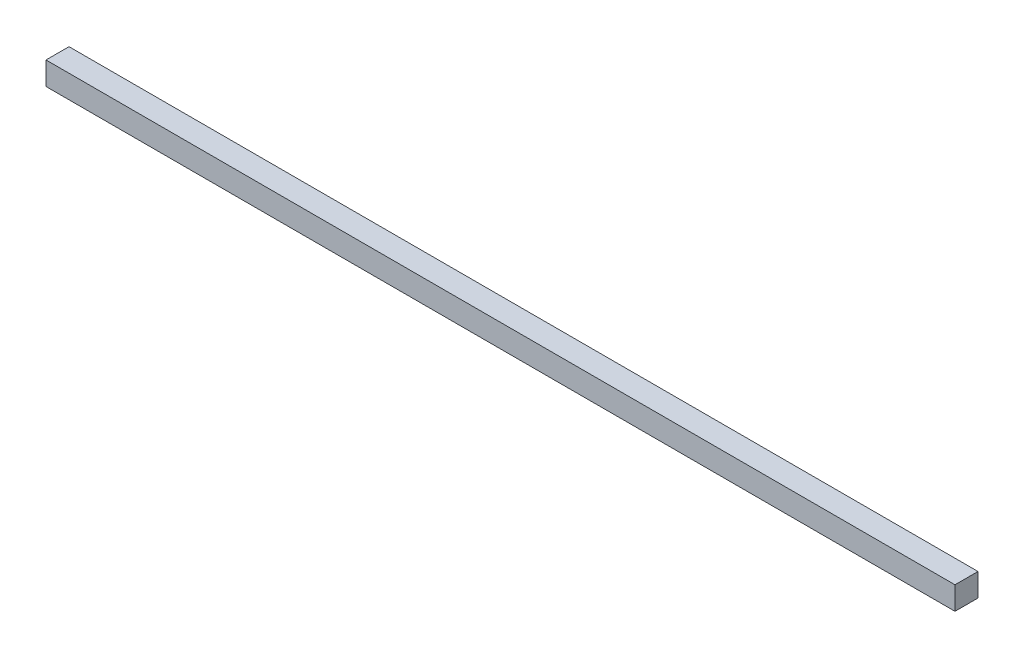
ISO-10303-21;
HEADER;
FILE_DESCRIPTION(('STEP AP214'),'2;1');
FILE_NAME('part.step','',(''),(''),'','','');
FILE_SCHEMA(('AUTOMOTIVE_DESIGN { 1 0 10303 214 1 1 1 1 }'));
ENDSEC;
DATA;
#1=APPLICATION_CONTEXT('core data for automotive mechanical design processes');
#2=APPLICATION_PROTOCOL_DEFINITION('international standard','automotive_design',2000,#1);
#3=PRODUCT_CONTEXT('',#1,'mechanical');
#4=PRODUCT('Part','Part','',(#3));
#5=PRODUCT_RELATED_PRODUCT_CATEGORY('part','',(#4));
#6=PRODUCT_DEFINITION_FORMATION('','',#4);
#7=PRODUCT_DEFINITION_CONTEXT('part definition',#1,'design');
#8=PRODUCT_DEFINITION('design','',#6,#7);
#9=PRODUCT_DEFINITION_SHAPE('','',#8);
#10=(LENGTH_UNIT() NAMED_UNIT(*) SI_UNIT(.MILLI.,.METRE.));
#11=(NAMED_UNIT(*) PLANE_ANGLE_UNIT() SI_UNIT($,.RADIAN.));
#12=(NAMED_UNIT(*) SI_UNIT($,.STERADIAN.) SOLID_ANGLE_UNIT());
#13=UNCERTAINTY_MEASURE_WITH_UNIT(LENGTH_MEASURE(1.E-05),#10,'distance_accuracy_value','');
#14=(GEOMETRIC_REPRESENTATION_CONTEXT(3) GLOBAL_UNCERTAINTY_ASSIGNED_CONTEXT((#13)) GLOBAL_UNIT_ASSIGNED_CONTEXT((#10,
#11,#12)) REPRESENTATION_CONTEXT('',''));
#15=CARTESIAN_POINT('',(0.,0.,0.));
#16=DIRECTION('',(0.,0.,1.));
#17=DIRECTION('',(1.,0.,0.));
#18=AXIS2_PLACEMENT_3D('',#15,#16,#17);
#19=CARTESIAN_POINT('',(0.,0.,6.35));
#20=DIRECTION('',(1.,0.,0.));
#21=DIRECTION('',(0.,0.,-1.));
#22=AXIS2_PLACEMENT_3D('',#19,#20,#21);
#23=PLANE('',#22);
#24=DIRECTION('',(0.,-1.,0.));
#25=VECTOR('',#24,1.);
#26=CARTESIAN_POINT('',(0.,0.,0.));
#27=LINE('',#26,#25);
#28=CARTESIAN_POINT('',(0.,6.34999999999999,0.));
#29=VERTEX_POINT('',#28);
#30=CARTESIAN_POINT('',(0.,0.,0.));
#31=VERTEX_POINT('',#30);
#32=EDGE_CURVE('E102',#29,#31,#27,.T.);
#33=ORIENTED_EDGE('',*,*,#32,.T.);
#34=DIRECTION('',(0.,0.,-1.));
#35=VECTOR('',#34,1.);
#36=CARTESIAN_POINT('',(0.,0.,6.35));
#37=LINE('',#36,#35);
#38=CARTESIAN_POINT('',(0.,0.,6.35));
#39=VERTEX_POINT('',#38);
#40=EDGE_CURVE('E11',#39,#31,#37,.T.);
#41=ORIENTED_EDGE('',*,*,#40,.F.);
#42=DIRECTION('',(0.,-1.,0.));
#43=VECTOR('',#42,1.);
#44=CARTESIAN_POINT('',(0.,0.,6.35));
#45=LINE('',#44,#43);
#46=CARTESIAN_POINT('',(0.,6.34999999999999,6.35));
#47=VERTEX_POINT('',#46);
#48=EDGE_CURVE('E90',#47,#39,#45,.T.);
#49=ORIENTED_EDGE('',*,*,#48,.F.);
#50=DIRECTION('',(0.,0.,-1.));
#51=VECTOR('',#50,1.);
#52=CARTESIAN_POINT('',(0.,6.34999999999999,6.35));
#53=LINE('',#52,#51);
#54=EDGE_CURVE('E98',#47,#29,#53,.T.);
#55=ORIENTED_EDGE('',*,*,#54,.T.);
#56=EDGE_LOOP('',(#33,#41,#49,#55));
#57=FACE_BOUND('',#56,.T.);
#58=ADVANCED_FACE('F39',(#57),#23,.F.);
#59=CARTESIAN_POINT('',(0.,0.,6.35));
#60=DIRECTION('',(0.,1.,0.));
#61=DIRECTION('',(0.,0.,1.));
#62=AXIS2_PLACEMENT_3D('',#59,#60,#61);
#63=PLANE('',#62);
#64=DIRECTION('',(1.,0.,0.));
#65=VECTOR('',#64,1.);
#66=CARTESIAN_POINT('',(0.,0.,0.));
#67=LINE('',#66,#65);
#68=CARTESIAN_POINT('',(250.825,0.,0.));
#69=VERTEX_POINT('',#68);
#70=EDGE_CURVE('E94',#31,#69,#67,.T.);
#71=ORIENTED_EDGE('',*,*,#70,.T.);
#72=DIRECTION('',(0.,0.,-1.));
#73=VECTOR('',#72,1.);
#74=CARTESIAN_POINT('',(250.825,0.,6.35));
#75=LINE('',#74,#73);
#76=CARTESIAN_POINT('',(250.825,0.,6.35));
#77=VERTEX_POINT('',#76);
#78=EDGE_CURVE('E47',#77,#69,#75,.T.);
#79=ORIENTED_EDGE('',*,*,#78,.F.);
#80=DIRECTION('',(1.,0.,0.));
#81=VECTOR('',#80,1.);
#82=CARTESIAN_POINT('',(0.,0.,6.35));
#83=LINE('',#82,#81);
#84=EDGE_CURVE('E85',#39,#77,#83,.T.);
#85=ORIENTED_EDGE('',*,*,#84,.F.);
#86=ORIENTED_EDGE('',*,*,#40,.T.);
#87=EDGE_LOOP('',(#71,#79,#85,#86));
#88=FACE_BOUND('',#87,.T.);
#89=ADVANCED_FACE('F93',(#88),#63,.F.);
#90=CARTESIAN_POINT('',(250.825,0.,6.35));
#91=DIRECTION('',(-1.,0.,0.));
#92=DIRECTION('',(0.,0.,1.));
#93=AXIS2_PLACEMENT_3D('',#90,#91,#92);
#94=PLANE('',#93);
#95=DIRECTION('',(0.,1.,0.));
#96=VECTOR('',#95,1.);
#97=CARTESIAN_POINT('',(250.825,0.,0.));
#98=LINE('',#97,#96);
#99=CARTESIAN_POINT('',(250.825,6.35,0.));
#100=VERTEX_POINT('',#99);
#101=EDGE_CURVE('E72',#69,#100,#98,.T.);
#102=ORIENTED_EDGE('',*,*,#101,.T.);
#103=DIRECTION('',(0.,0.,-1.));
#104=VECTOR('',#103,1.);
#105=CARTESIAN_POINT('',(250.825,6.35,6.35));
#106=LINE('',#105,#104);
#107=CARTESIAN_POINT('',(250.825,6.35,6.35));
#108=VERTEX_POINT('',#107);
#109=EDGE_CURVE('E95',#108,#100,#106,.T.);
#110=ORIENTED_EDGE('',*,*,#109,.F.);
#111=DIRECTION('',(0.,1.,0.));
#112=VECTOR('',#111,1.);
#113=CARTESIAN_POINT('',(250.825,0.,6.35));
#114=LINE('',#113,#112);
#115=EDGE_CURVE('E88',#77,#108,#114,.T.);
#116=ORIENTED_EDGE('',*,*,#115,.F.);
#117=ORIENTED_EDGE('',*,*,#78,.T.);
#118=EDGE_LOOP('',(#102,#110,#116,#117));
#119=FACE_BOUND('',#118,.T.);
#120=ADVANCED_FACE('F96',(#119),#94,.F.);
#121=CARTESIAN_POINT('',(0.,6.34999999999999,6.35));
#122=DIRECTION('',(0.,-1.,0.));
#123=DIRECTION('',(1.,0.,0.));
#124=AXIS2_PLACEMENT_3D('',#121,#122,#123);
#125=PLANE('',#124);
#126=DIRECTION('',(-1.,0.,0.));
#127=VECTOR('',#126,1.);
#128=CARTESIAN_POINT('',(0.,6.34999999999999,0.));
#129=LINE('',#128,#127);
#130=EDGE_CURVE('E78',#100,#29,#129,.T.);
#131=ORIENTED_EDGE('',*,*,#130,.T.);
#132=ORIENTED_EDGE('',*,*,#54,.F.);
#133=DIRECTION('',(-1.,0.,0.));
#134=VECTOR('',#133,1.);
#135=CARTESIAN_POINT('',(0.,6.34999999999999,6.35));
#136=LINE('',#135,#134);
#137=EDGE_CURVE('E55',#108,#47,#136,.T.);
#138=ORIENTED_EDGE('',*,*,#137,.F.);
#139=ORIENTED_EDGE('',*,*,#109,.T.);
#140=EDGE_LOOP('',(#131,#132,#138,#139));
#141=FACE_BOUND('',#140,.T.);
#142=ADVANCED_FACE('F109',(#141),#125,.F.);
#143=CARTESIAN_POINT('',(0.,0.,6.35));
#144=DIRECTION('',(0.,0.,-1.));
#145=DIRECTION('',(-1.,0.,0.));
#146=AXIS2_PLACEMENT_3D('',#143,#144,#145);
#147=PLANE('',#146);
#148=ORIENTED_EDGE('',*,*,#48,.T.);
#149=ORIENTED_EDGE('',*,*,#84,.T.);
#150=ORIENTED_EDGE('',*,*,#115,.T.);
#151=ORIENTED_EDGE('',*,*,#137,.T.);
#152=EDGE_LOOP('',(#148,#149,#150,#151));
#153=FACE_BOUND('',#152,.T.);
#154=ADVANCED_FACE('F86',(#153),#147,.F.);
#155=CARTESIAN_POINT('',(0.,0.,0.));
#156=DIRECTION('',(0.,0.,-1.));
#157=DIRECTION('',(-1.,0.,0.));
#158=AXIS2_PLACEMENT_3D('',#155,#156,#157);
#159=PLANE('',#158);
#160=ORIENTED_EDGE('',*,*,#32,.F.);
#161=ORIENTED_EDGE('',*,*,#130,.F.);
#162=ORIENTED_EDGE('',*,*,#101,.F.);
#163=ORIENTED_EDGE('',*,*,#70,.F.);
#164=EDGE_LOOP('',(#160,#161,#162,#163));
#165=FACE_BOUND('',#164,.T.);
#166=ADVANCED_FACE('F112',(#165),#159,.T.);
#167=CLOSED_SHELL('',(#58,#89,#120,#142,#154,#166));
#168=MANIFOLD_SOLID_BREP('B2',#167);
#169=ADVANCED_BREP_SHAPE_REPRESENTATION('',(#18,#168),#14);
#170=SHAPE_DEFINITION_REPRESENTATION(#9,#169);
ENDSEC;
END-ISO-10303-21;
